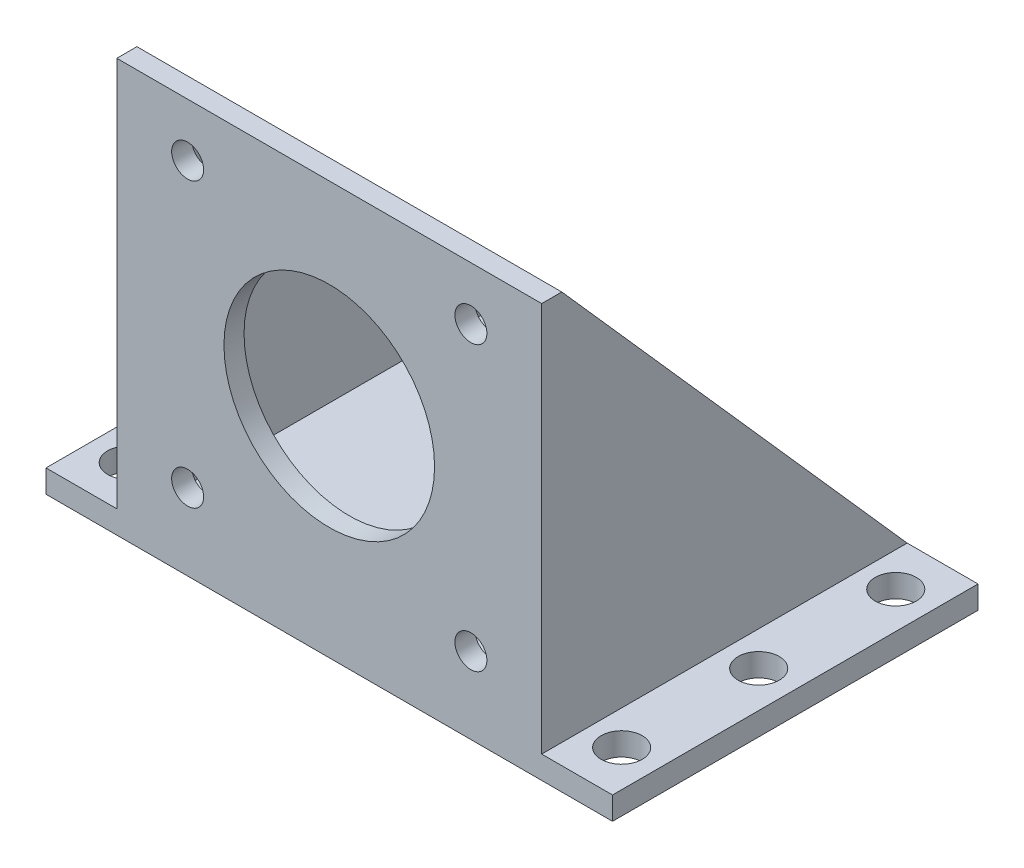
ISO-10303-21;
HEADER;
FILE_DESCRIPTION(('STEP AP214'),'2;1');
FILE_NAME('part.step','',(''),(''),'','','');
FILE_SCHEMA(('AUTOMOTIVE_DESIGN { 1 0 10303 214 1 1 1 1 }'));
ENDSEC;
DATA;
#1=APPLICATION_CONTEXT('core data for automotive mechanical design processes');
#2=APPLICATION_PROTOCOL_DEFINITION('international standard','automotive_design',2000,#1);
#3=PRODUCT_CONTEXT('',#1,'mechanical');
#4=PRODUCT('Part','Part','',(#3));
#5=PRODUCT_RELATED_PRODUCT_CATEGORY('part','',(#4));
#6=PRODUCT_DEFINITION_FORMATION('','',#4);
#7=PRODUCT_DEFINITION_CONTEXT('part definition',#1,'design');
#8=PRODUCT_DEFINITION('design','',#6,#7);
#9=PRODUCT_DEFINITION_SHAPE('','',#8);
#10=(LENGTH_UNIT() NAMED_UNIT(*) SI_UNIT(.MILLI.,.METRE.));
#11=(NAMED_UNIT(*) PLANE_ANGLE_UNIT() SI_UNIT($,.RADIAN.));
#12=(NAMED_UNIT(*) SI_UNIT($,.STERADIAN.) SOLID_ANGLE_UNIT());
#13=UNCERTAINTY_MEASURE_WITH_UNIT(LENGTH_MEASURE(1.E-05),#10,'distance_accuracy_value','');
#14=(GEOMETRIC_REPRESENTATION_CONTEXT(3) GLOBAL_UNCERTAINTY_ASSIGNED_CONTEXT((#13)) GLOBAL_UNIT_ASSIGNED_CONTEXT((#10,
#11,#12)) REPRESENTATION_CONTEXT('',''));
#15=CARTESIAN_POINT('',(0.,0.,0.));
#16=DIRECTION('',(0.,0.,1.));
#17=DIRECTION('',(1.,0.,0.));
#18=AXIS2_PLACEMENT_3D('',#15,#16,#17);
#19=CARTESIAN_POINT('',(0.,2.5,0.));
#20=DIRECTION('',(0.,1.,0.));
#21=DIRECTION('',(0.,0.,1.));
#22=AXIS2_PLACEMENT_3D('',#19,#20,#21);
#23=PLANE('',#22);
#24=DIRECTION('',(-1.,0.,0.));
#25=VECTOR('',#24,1.);
#26=CARTESIAN_POINT('',(0.,2.5,17.8));
#27=LINE('',#26,#25);
#28=CARTESIAN_POINT('',(21.65,2.5,17.8));
#29=VERTEX_POINT('',#28);
#30=CARTESIAN_POINT('',(-21.65,2.5,17.8));
#31=VERTEX_POINT('',#30);
#32=EDGE_CURVE('E130',#29,#31,#27,.T.);
#33=ORIENTED_EDGE('',*,*,#32,.F.);
#34=DIRECTION('',(0.,0.,-1.));
#35=VECTOR('',#34,1.);
#36=CARTESIAN_POINT('',(21.65,2.5,17.8));
#37=LINE('',#36,#35);
#38=CARTESIAN_POINT('',(21.65,2.5,-20.));
#39=VERTEX_POINT('',#38);
#40=EDGE_CURVE('E119',#29,#39,#37,.T.);
#41=ORIENTED_EDGE('',*,*,#40,.T.);
#42=DIRECTION('',(-1.,0.,0.));
#43=VECTOR('',#42,1.);
#44=CARTESIAN_POINT('',(-31.,2.5,-20.));
#45=LINE('',#44,#43);
#46=CARTESIAN_POINT('',(-21.65,2.5,-20.));
#47=VERTEX_POINT('',#46);
#48=EDGE_CURVE('E57',#39,#47,#45,.T.);
#49=ORIENTED_EDGE('',*,*,#48,.T.);
#50=DIRECTION('',(0.,0.,1.));
#51=VECTOR('',#50,1.);
#52=CARTESIAN_POINT('',(-21.65,2.5,17.8));
#53=LINE('',#52,#51);
#54=EDGE_CURVE('E136',#47,#31,#53,.T.);
#55=ORIENTED_EDGE('',*,*,#54,.T.);
#56=EDGE_LOOP('',(#33,#41,#49,#55));
#57=FACE_BOUND('',#56,.T.);
#58=ADVANCED_FACE('F34',(#57),#23,.T.);
#59=CARTESIAN_POINT('',(0.,0.,17.8));
#60=DIRECTION('',(0.,0.,1.));
#61=DIRECTION('',(1.,0.,0.));
#62=AXIS2_PLACEMENT_3D('',#59,#60,#61);
#63=PLANE('',#62);
#64=CARTESIAN_POINT('',(15.4999999999999,39.3750000000001,17.8));
#65=DIRECTION('',(0.,0.,1.));
#66=DIRECTION('',(1.,0.,0.));
#67=AXIS2_PLACEMENT_3D('',#64,#65,#66);
#68=CIRCLE('',#67,1.75000000000006);
#69=CARTESIAN_POINT('',(17.25,39.3750000000001,17.8));
#70=VERTEX_POINT('',#69);
#71=EDGE_CURVE('E173',#70,#70,#68,.T.);
#72=ORIENTED_EDGE('',*,*,#71,.T.);
#73=EDGE_LOOP('',(#72));
#74=FACE_BOUND('',#73,.T.);
#75=CARTESIAN_POINT('',(-15.5000000000001,39.375,17.8));
#76=DIRECTION('',(0.,0.,1.));
#77=DIRECTION('',(1.,0.,0.));
#78=AXIS2_PLACEMENT_3D('',#75,#76,#77);
#79=CIRCLE('',#78,1.75000000000008);
#80=CARTESIAN_POINT('',(-13.75,39.375,17.8));
#81=VERTEX_POINT('',#80);
#82=EDGE_CURVE('E302',#81,#81,#79,.T.);
#83=ORIENTED_EDGE('',*,*,#82,.T.);
#84=EDGE_LOOP('',(#83));
#85=FACE_BOUND('',#84,.T.);
#86=CARTESIAN_POINT('',(-15.5,8.37499999999999,17.8));
#87=DIRECTION('',(0.,0.,1.));
#88=DIRECTION('',(1.,0.,0.));
#89=AXIS2_PLACEMENT_3D('',#86,#87,#88);
#90=CIRCLE('',#89,1.75);
#91=CARTESIAN_POINT('',(-13.75,8.37499999999999,17.8));
#92=VERTEX_POINT('',#91);
#93=EDGE_CURVE('E305',#92,#92,#90,.T.);
#94=ORIENTED_EDGE('',*,*,#93,.T.);
#95=EDGE_LOOP('',(#94));
#96=FACE_BOUND('',#95,.T.);
#97=CARTESIAN_POINT('',(15.5,8.37499999999994,17.8));
#98=DIRECTION('',(0.,0.,1.));
#99=DIRECTION('',(1.,0.,0.));
#100=AXIS2_PLACEMENT_3D('',#97,#98,#99);
#101=CIRCLE('',#100,1.75);
#102=CARTESIAN_POINT('',(17.25,8.37499999999994,17.8));
#103=VERTEX_POINT('',#102);
#104=EDGE_CURVE('E143',#103,#103,#101,.T.);
#105=ORIENTED_EDGE('',*,*,#104,.T.);
#106=EDGE_LOOP('',(#105));
#107=FACE_BOUND('',#106,.T.);
#108=CARTESIAN_POINT('',(0.,23.875,17.8));
#109=DIRECTION('',(0.,0.,1.));
#110=DIRECTION('',(1.,0.,0.));
#111=AXIS2_PLACEMENT_3D('',#108,#109,#110);
#112=CIRCLE('',#111,11.525);
#113=CARTESIAN_POINT('',(11.525,23.875,17.8));
#114=VERTEX_POINT('',#113);
#115=EDGE_CURVE('E138',#114,#114,#112,.T.);
#116=ORIENTED_EDGE('',*,*,#115,.T.);
#117=EDGE_LOOP('',(#116));
#118=FACE_BOUND('',#117,.T.);
#119=DIRECTION('',(0.,-1.,0.));
#120=VECTOR('',#119,1.);
#121=CARTESIAN_POINT('',(21.65,45.2,17.8));
#122=LINE('',#121,#120);
#123=CARTESIAN_POINT('',(21.65,45.2,17.8));
#124=VERTEX_POINT('',#123);
#125=EDGE_CURVE('E122',#124,#29,#122,.T.);
#126=ORIENTED_EDGE('',*,*,#125,.T.);
#127=ORIENTED_EDGE('',*,*,#32,.T.);
#128=DIRECTION('',(0.,1.,0.));
#129=VECTOR('',#128,1.);
#130=CARTESIAN_POINT('',(-21.65,45.2,17.8));
#131=LINE('',#130,#129);
#132=CARTESIAN_POINT('',(-21.65,45.2,17.8));
#133=VERTEX_POINT('',#132);
#134=EDGE_CURVE('E291',#31,#133,#131,.T.);
#135=ORIENTED_EDGE('',*,*,#134,.T.);
#136=DIRECTION('',(1.,0.,0.));
#137=VECTOR('',#136,1.);
#138=CARTESIAN_POINT('',(0.,45.2,17.8));
#139=LINE('',#138,#137);
#140=EDGE_CURVE('E132',#133,#124,#139,.T.);
#141=ORIENTED_EDGE('',*,*,#140,.T.);
#142=EDGE_LOOP('',(#126,#127,#135,#141));
#143=FACE_BOUND('',#142,.T.);
#144=ADVANCED_FACE('F129',(#74,#85,#96,#107,#118,#143),#63,.F.);
#145=CARTESIAN_POINT('',(31.,2.5,-20.));
#146=VERTEX_POINT('',#145);
#147=CARTESIAN_POINT('',(23.25,2.5,-20.));
#148=VERTEX_POINT('',#147);
#149=EDGE_CURVE('E224',#146,#148,#45,.T.);
#150=ORIENTED_EDGE('',*,*,#149,.T.);
#151=DIRECTION('',(0.,0.,1.));
#152=VECTOR('',#151,1.);
#153=CARTESIAN_POINT('',(23.25,2.5,17.8));
#154=LINE('',#153,#152);
#155=CARTESIAN_POINT('',(23.25,2.5,20.));
#156=VERTEX_POINT('',#155);
#157=EDGE_CURVE('E148',#148,#156,#154,.T.);
#158=ORIENTED_EDGE('',*,*,#157,.T.);
#159=DIRECTION('',(1.,0.,0.));
#160=VECTOR('',#159,1.);
#161=CARTESIAN_POINT('',(-31.,2.5,20.));
#162=LINE('',#161,#160);
#163=CARTESIAN_POINT('',(31.,2.5,20.));
#164=VERTEX_POINT('',#163);
#165=EDGE_CURVE('E229',#156,#164,#162,.T.);
#166=ORIENTED_EDGE('',*,*,#165,.T.);
#167=DIRECTION('',(0.,0.,-1.));
#168=VECTOR('',#167,1.);
#169=CARTESIAN_POINT('',(31.,2.5,-20.));
#170=LINE('',#169,#168);
#171=EDGE_CURVE('E219',#164,#146,#170,.T.);
#172=ORIENTED_EDGE('',*,*,#171,.T.);
#173=EDGE_LOOP('',(#150,#158,#166,#172));
#174=FACE_BOUND('',#173,.T.);
#175=CARTESIAN_POINT('',(27.0000000000002,2.5,15.));
#176=DIRECTION('',(0.,1.,0.));
#177=DIRECTION('',(0.,0.,1.));
#178=AXIS2_PLACEMENT_3D('',#175,#176,#177);
#179=CIRCLE('',#178,2.25);
#180=CARTESIAN_POINT('',(27.0000000000002,2.5,17.25));
#181=VERTEX_POINT('',#180);
#182=EDGE_CURVE('E183',#181,#181,#179,.T.);
#183=ORIENTED_EDGE('',*,*,#182,.F.);
#184=EDGE_LOOP('',(#183));
#185=FACE_BOUND('',#184,.T.);
#186=CARTESIAN_POINT('',(27.,2.5,-15.));
#187=DIRECTION('',(0.,1.,0.));
#188=DIRECTION('',(0.,0.,1.));
#189=AXIS2_PLACEMENT_3D('',#186,#187,#188);
#190=CIRCLE('',#189,2.25);
#191=CARTESIAN_POINT('',(27.,2.5,-12.75));
#192=VERTEX_POINT('',#191);
#193=EDGE_CURVE('E195',#192,#192,#190,.T.);
#194=ORIENTED_EDGE('',*,*,#193,.F.);
#195=EDGE_LOOP('',(#194));
#196=FACE_BOUND('',#195,.T.);
#197=CARTESIAN_POINT('',(27.,2.5,0.));
#198=DIRECTION('',(0.,1.,0.));
#199=DIRECTION('',(0.,0.,1.));
#200=AXIS2_PLACEMENT_3D('',#197,#198,#199);
#201=CIRCLE('',#200,2.25);
#202=CARTESIAN_POINT('',(27.,2.5,2.24999999999999));
#203=VERTEX_POINT('',#202);
#204=EDGE_CURVE('E207',#203,#203,#201,.T.);
#205=ORIENTED_EDGE('',*,*,#204,.F.);
#206=EDGE_LOOP('',(#205));
#207=FACE_BOUND('',#206,.T.);
#208=ADVANCED_FACE('F267',(#174,#185,#196,#207),#23,.T.);
#209=DIRECTION('',(0.,0.,1.));
#210=VECTOR('',#209,1.);
#211=CARTESIAN_POINT('',(-23.25,2.5,17.8));
#212=LINE('',#211,#210);
#213=CARTESIAN_POINT('',(-23.25,2.5,-20.));
#214=VERTEX_POINT('',#213);
#215=CARTESIAN_POINT('',(-23.25,2.5,20.));
#216=VERTEX_POINT('',#215);
#217=EDGE_CURVE('E49',#214,#216,#212,.T.);
#218=ORIENTED_EDGE('',*,*,#217,.F.);
#219=CARTESIAN_POINT('',(-31.,2.5,-20.));
#220=VERTEX_POINT('',#219);
#221=EDGE_CURVE('E222',#214,#220,#45,.T.);
#222=ORIENTED_EDGE('',*,*,#221,.T.);
#223=DIRECTION('',(0.,0.,1.));
#224=VECTOR('',#223,1.);
#225=CARTESIAN_POINT('',(-31.,2.5,-20.));
#226=LINE('',#225,#224);
#227=CARTESIAN_POINT('',(-31.,2.5,20.));
#228=VERTEX_POINT('',#227);
#229=EDGE_CURVE('E227',#220,#228,#226,.T.);
#230=ORIENTED_EDGE('',*,*,#229,.T.);
#231=EDGE_CURVE('E230',#228,#216,#162,.T.);
#232=ORIENTED_EDGE('',*,*,#231,.T.);
#233=EDGE_LOOP('',(#218,#222,#230,#232));
#234=FACE_BOUND('',#233,.T.);
#235=CARTESIAN_POINT('',(-26.9999999999998,2.5,15.));
#236=DIRECTION('',(0.,1.,0.));
#237=DIRECTION('',(0.,0.,1.));
#238=AXIS2_PLACEMENT_3D('',#235,#236,#237);
#239=CIRCLE('',#238,2.25);
#240=CARTESIAN_POINT('',(-26.9999999999998,2.5,17.25));
#241=VERTEX_POINT('',#240);
#242=EDGE_CURVE('E189',#241,#241,#239,.T.);
#243=ORIENTED_EDGE('',*,*,#242,.F.);
#244=EDGE_LOOP('',(#243));
#245=FACE_BOUND('',#244,.T.);
#246=CARTESIAN_POINT('',(-27.,2.5,-15.));
#247=DIRECTION('',(0.,1.,0.));
#248=DIRECTION('',(0.,0.,1.));
#249=AXIS2_PLACEMENT_3D('',#246,#247,#248);
#250=CIRCLE('',#249,2.25);
#251=CARTESIAN_POINT('',(-27.,2.5,-12.75));
#252=VERTEX_POINT('',#251);
#253=EDGE_CURVE('E201',#252,#252,#250,.T.);
#254=ORIENTED_EDGE('',*,*,#253,.F.);
#255=EDGE_LOOP('',(#254));
#256=FACE_BOUND('',#255,.T.);
#257=CARTESIAN_POINT('',(-27.,2.5,0.));
#258=DIRECTION('',(0.,1.,0.));
#259=DIRECTION('',(0.,0.,1.));
#260=AXIS2_PLACEMENT_3D('',#257,#258,#259);
#261=CIRCLE('',#260,2.25);
#262=CARTESIAN_POINT('',(-27.,2.5,2.25));
#263=VERTEX_POINT('',#262);
#264=EDGE_CURVE('E213',#263,#263,#261,.T.);
#265=ORIENTED_EDGE('',*,*,#264,.F.);
#266=EDGE_LOOP('',(#265));
#267=FACE_BOUND('',#266,.T.);
#268=ADVANCED_FACE('F337',(#234,#245,#256,#267),#23,.T.);
#269=CARTESIAN_POINT('',(0.,0.,0.));
#270=DIRECTION('',(0.,1.,0.));
#271=DIRECTION('',(0.,0.,1.));
#272=AXIS2_PLACEMENT_3D('',#269,#270,#271);
#273=PLANE('',#272);
#274=DIRECTION('',(0.,0.,-1.));
#275=VECTOR('',#274,1.);
#276=CARTESIAN_POINT('',(31.,0.,-20.));
#277=LINE('',#276,#275);
#278=CARTESIAN_POINT('',(31.,0.,20.));
#279=VERTEX_POINT('',#278);
#280=CARTESIAN_POINT('',(31.,0.,-20.));
#281=VERTEX_POINT('',#280);
#282=EDGE_CURVE('E216',#279,#281,#277,.T.);
#283=ORIENTED_EDGE('',*,*,#282,.F.);
#284=DIRECTION('',(1.,0.,0.));
#285=VECTOR('',#284,1.);
#286=CARTESIAN_POINT('',(-31.,0.,20.));
#287=LINE('',#286,#285);
#288=CARTESIAN_POINT('',(-31.,0.,20.));
#289=VERTEX_POINT('',#288);
#290=EDGE_CURVE('E223',#289,#279,#287,.T.);
#291=ORIENTED_EDGE('',*,*,#290,.F.);
#292=DIRECTION('',(0.,0.,1.));
#293=VECTOR('',#292,1.);
#294=CARTESIAN_POINT('',(-31.,0.,-20.));
#295=LINE('',#294,#293);
#296=CARTESIAN_POINT('',(-31.,0.,-20.));
#297=VERTEX_POINT('',#296);
#298=EDGE_CURVE('E237',#297,#289,#295,.T.);
#299=ORIENTED_EDGE('',*,*,#298,.F.);
#300=DIRECTION('',(-1.,0.,0.));
#301=VECTOR('',#300,1.);
#302=CARTESIAN_POINT('',(-31.,0.,-20.));
#303=LINE('',#302,#301);
#304=EDGE_CURVE('E235',#281,#297,#303,.T.);
#305=ORIENTED_EDGE('',*,*,#304,.F.);
#306=EDGE_LOOP('',(#283,#291,#299,#305));
#307=FACE_BOUND('',#306,.T.);
#308=CARTESIAN_POINT('',(-27.,0.,0.));
#309=DIRECTION('',(0.,1.,0.));
#310=DIRECTION('',(0.,0.,1.));
#311=AXIS2_PLACEMENT_3D('',#308,#309,#310);
#312=CIRCLE('',#311,2.25);
#313=CARTESIAN_POINT('',(-27.,0.,2.25));
#314=VERTEX_POINT('',#313);
#315=EDGE_CURVE('E210',#314,#314,#312,.T.);
#316=ORIENTED_EDGE('',*,*,#315,.T.);
#317=EDGE_LOOP('',(#316));
#318=FACE_BOUND('',#317,.T.);
#319=CARTESIAN_POINT('',(27.,0.,0.));
#320=DIRECTION('',(0.,1.,0.));
#321=DIRECTION('',(0.,0.,1.));
#322=AXIS2_PLACEMENT_3D('',#319,#320,#321);
#323=CIRCLE('',#322,2.25);
#324=CARTESIAN_POINT('',(27.,0.,2.24999999999999));
#325=VERTEX_POINT('',#324);
#326=EDGE_CURVE('E204',#325,#325,#323,.T.);
#327=ORIENTED_EDGE('',*,*,#326,.T.);
#328=EDGE_LOOP('',(#327));
#329=FACE_BOUND('',#328,.T.);
#330=CARTESIAN_POINT('',(-27.,0.,-15.));
#331=DIRECTION('',(0.,1.,0.));
#332=DIRECTION('',(0.,0.,1.));
#333=AXIS2_PLACEMENT_3D('',#330,#331,#332);
#334=CIRCLE('',#333,2.25);
#335=CARTESIAN_POINT('',(-27.,0.,-12.75));
#336=VERTEX_POINT('',#335);
#337=EDGE_CURVE('E198',#336,#336,#334,.T.);
#338=ORIENTED_EDGE('',*,*,#337,.T.);
#339=EDGE_LOOP('',(#338));
#340=FACE_BOUND('',#339,.T.);
#341=CARTESIAN_POINT('',(27.,0.,-15.));
#342=DIRECTION('',(0.,1.,0.));
#343=DIRECTION('',(0.,0.,1.));
#344=AXIS2_PLACEMENT_3D('',#341,#342,#343);
#345=CIRCLE('',#344,2.25);
#346=CARTESIAN_POINT('',(27.,0.,-12.75));
#347=VERTEX_POINT('',#346);
#348=EDGE_CURVE('E192',#347,#347,#345,.T.);
#349=ORIENTED_EDGE('',*,*,#348,.T.);
#350=EDGE_LOOP('',(#349));
#351=FACE_BOUND('',#350,.T.);
#352=CARTESIAN_POINT('',(-26.9999999999998,0.,15.));
#353=DIRECTION('',(0.,1.,0.));
#354=DIRECTION('',(0.,0.,1.));
#355=AXIS2_PLACEMENT_3D('',#352,#353,#354);
#356=CIRCLE('',#355,2.25);
#357=CARTESIAN_POINT('',(-26.9999999999998,0.,17.25));
#358=VERTEX_POINT('',#357);
#359=EDGE_CURVE('E186',#358,#358,#356,.T.);
#360=ORIENTED_EDGE('',*,*,#359,.T.);
#361=EDGE_LOOP('',(#360));
#362=FACE_BOUND('',#361,.T.);
#363=CARTESIAN_POINT('',(27.0000000000002,0.,15.));
#364=DIRECTION('',(0.,1.,0.));
#365=DIRECTION('',(0.,0.,1.));
#366=AXIS2_PLACEMENT_3D('',#363,#364,#365);
#367=CIRCLE('',#366,2.25);
#368=CARTESIAN_POINT('',(27.0000000000002,0.,17.25));
#369=VERTEX_POINT('',#368);
#370=EDGE_CURVE('E175',#369,#369,#367,.T.);
#371=ORIENTED_EDGE('',*,*,#370,.T.);
#372=EDGE_LOOP('',(#371));
#373=FACE_BOUND('',#372,.T.);
#374=ADVANCED_FACE('F255',(#307,#318,#329,#340,#351,#362,#373),#273,.F.);
#375=CARTESIAN_POINT('',(31.,2.5,-20.));
#376=DIRECTION('',(-1.,0.,0.));
#377=DIRECTION('',(0.,0.,1.));
#378=AXIS2_PLACEMENT_3D('',#375,#376,#377);
#379=PLANE('',#378);
#380=ORIENTED_EDGE('',*,*,#282,.T.);
#381=DIRECTION('',(0.,-1.,0.));
#382=VECTOR('',#381,1.);
#383=CARTESIAN_POINT('',(31.,2.5,-20.));
#384=LINE('',#383,#382);
#385=EDGE_CURVE('E11',#146,#281,#384,.T.);
#386=ORIENTED_EDGE('',*,*,#385,.F.);
#387=ORIENTED_EDGE('',*,*,#171,.F.);
#388=DIRECTION('',(0.,-1.,0.));
#389=VECTOR('',#388,1.);
#390=CARTESIAN_POINT('',(31.,2.5,20.));
#391=LINE('',#390,#389);
#392=EDGE_CURVE('E232',#164,#279,#391,.T.);
#393=ORIENTED_EDGE('',*,*,#392,.T.);
#394=EDGE_LOOP('',(#380,#386,#387,#393));
#395=FACE_BOUND('',#394,.T.);
#396=ADVANCED_FACE('F36',(#395),#379,.F.);
#397=CARTESIAN_POINT('',(-31.,2.5,-20.));
#398=DIRECTION('',(0.,0.,1.));
#399=DIRECTION('',(1.,0.,0.));
#400=AXIS2_PLACEMENT_3D('',#397,#398,#399);
#401=PLANE('',#400);
#402=ORIENTED_EDGE('',*,*,#304,.T.);
#403=DIRECTION('',(0.,-1.,0.));
#404=VECTOR('',#403,1.);
#405=CARTESIAN_POINT('',(-31.,2.5,-20.));
#406=LINE('',#405,#404);
#407=EDGE_CURVE('E42',#220,#297,#406,.T.);
#408=ORIENTED_EDGE('',*,*,#407,.F.);
#409=ORIENTED_EDGE('',*,*,#221,.F.);
#410=DIRECTION('',(-1.,0.,0.));
#411=VECTOR('',#410,1.);
#412=CARTESIAN_POINT('',(-21.65,2.5,-20.));
#413=LINE('',#412,#411);
#414=EDGE_CURVE('E153',#47,#214,#413,.T.);
#415=ORIENTED_EDGE('',*,*,#414,.F.);
#416=ORIENTED_EDGE('',*,*,#48,.F.);
#417=DIRECTION('',(1.,0.,0.));
#418=VECTOR('',#417,1.);
#419=CARTESIAN_POINT('',(21.65,2.5,-20.));
#420=LINE('',#419,#418);
#421=EDGE_CURVE('E293',#39,#148,#420,.T.);
#422=ORIENTED_EDGE('',*,*,#421,.T.);
#423=ORIENTED_EDGE('',*,*,#149,.F.);
#424=ORIENTED_EDGE('',*,*,#385,.T.);
#425=EDGE_LOOP('',(#402,#408,#409,#415,#416,#422,#423,#424));
#426=FACE_BOUND('',#425,.T.);
#427=ADVANCED_FACE('F522',(#426),#401,.F.);
#428=CARTESIAN_POINT('',(-31.,2.5,-20.));
#429=DIRECTION('',(1.,0.,0.));
#430=DIRECTION('',(0.,0.,-1.));
#431=AXIS2_PLACEMENT_3D('',#428,#429,#430);
#432=PLANE('',#431);
#433=ORIENTED_EDGE('',*,*,#298,.T.);
#434=DIRECTION('',(0.,-1.,0.));
#435=VECTOR('',#434,1.);
#436=CARTESIAN_POINT('',(-31.,2.5,20.));
#437=LINE('',#436,#435);
#438=EDGE_CURVE('E242',#228,#289,#437,.T.);
#439=ORIENTED_EDGE('',*,*,#438,.F.);
#440=ORIENTED_EDGE('',*,*,#229,.F.);
#441=ORIENTED_EDGE('',*,*,#407,.T.);
#442=EDGE_LOOP('',(#433,#439,#440,#441));
#443=FACE_BOUND('',#442,.T.);
#444=ADVANCED_FACE('F249',(#443),#432,.F.);
#445=CARTESIAN_POINT('',(-31.,2.5,20.));
#446=DIRECTION('',(0.,0.,-1.));
#447=DIRECTION('',(-1.,0.,0.));
#448=AXIS2_PLACEMENT_3D('',#445,#446,#447);
#449=PLANE('',#448);
#450=ORIENTED_EDGE('',*,*,#290,.T.);
#451=ORIENTED_EDGE('',*,*,#392,.F.);
#452=ORIENTED_EDGE('',*,*,#165,.F.);
#453=DIRECTION('',(0.,1.,0.));
#454=VECTOR('',#453,1.);
#455=CARTESIAN_POINT('',(23.25,0.,20.));
#456=LINE('',#455,#454);
#457=CARTESIAN_POINT('',(23.25,45.2,20.));
#458=VERTEX_POINT('',#457);
#459=EDGE_CURVE('E165',#156,#458,#456,.T.);
#460=ORIENTED_EDGE('',*,*,#459,.T.);
#461=DIRECTION('',(1.,0.,0.));
#462=VECTOR('',#461,1.);
#463=CARTESIAN_POINT('',(0.,45.2,20.));
#464=LINE('',#463,#462);
#465=CARTESIAN_POINT('',(-23.25,45.2,20.));
#466=VERTEX_POINT('',#465);
#467=EDGE_CURVE('E168',#466,#458,#464,.T.);
#468=ORIENTED_EDGE('',*,*,#467,.F.);
#469=DIRECTION('',(0.,1.,0.));
#470=VECTOR('',#469,1.);
#471=CARTESIAN_POINT('',(-23.25,0.,20.));
#472=LINE('',#471,#470);
#473=EDGE_CURVE('E171',#216,#466,#472,.T.);
#474=ORIENTED_EDGE('',*,*,#473,.F.);
#475=ORIENTED_EDGE('',*,*,#231,.F.);
#476=ORIENTED_EDGE('',*,*,#438,.T.);
#477=EDGE_LOOP('',(#450,#451,#452,#460,#468,#474,#475,#476));
#478=FACE_BOUND('',#477,.T.);
#479=CARTESIAN_POINT('',(15.4999999999999,39.3750000000001,20.));
#480=DIRECTION('',(0.,0.,1.));
#481=DIRECTION('',(1.,0.,0.));
#482=AXIS2_PLACEMENT_3D('',#479,#480,#481);
#483=CIRCLE('',#482,1.75000000000006);
#484=CARTESIAN_POINT('',(17.25,39.3750000000001,20.));
#485=VERTEX_POINT('',#484);
#486=EDGE_CURVE('E149',#485,#485,#483,.T.);
#487=ORIENTED_EDGE('',*,*,#486,.F.);
#488=EDGE_LOOP('',(#487));
#489=FACE_BOUND('',#488,.T.);
#490=CARTESIAN_POINT('',(-15.5000000000001,39.375,20.));
#491=DIRECTION('',(0.,0.,1.));
#492=DIRECTION('',(1.,0.,0.));
#493=AXIS2_PLACEMENT_3D('',#490,#491,#492);
#494=CIRCLE('',#493,1.75000000000008);
#495=CARTESIAN_POINT('',(-13.75,39.375,20.));
#496=VERTEX_POINT('',#495);
#497=EDGE_CURVE('E152',#496,#496,#494,.T.);
#498=ORIENTED_EDGE('',*,*,#497,.F.);
#499=EDGE_LOOP('',(#498));
#500=FACE_BOUND('',#499,.T.);
#501=CARTESIAN_POINT('',(-15.5,8.37499999999999,20.));
#502=DIRECTION('',(0.,0.,1.));
#503=DIRECTION('',(1.,0.,0.));
#504=AXIS2_PLACEMENT_3D('',#501,#502,#503);
#505=CIRCLE('',#504,1.75);
#506=CARTESIAN_POINT('',(-13.75,8.37499999999999,20.));
#507=VERTEX_POINT('',#506);
#508=EDGE_CURVE('E156',#507,#507,#505,.T.);
#509=ORIENTED_EDGE('',*,*,#508,.F.);
#510=EDGE_LOOP('',(#509));
#511=FACE_BOUND('',#510,.T.);
#512=CARTESIAN_POINT('',(15.5,8.37499999999994,20.));
#513=DIRECTION('',(0.,0.,1.));
#514=DIRECTION('',(1.,0.,0.));
#515=AXIS2_PLACEMENT_3D('',#512,#513,#514);
#516=CIRCLE('',#515,1.75);
#517=CARTESIAN_POINT('',(17.25,8.37499999999994,20.));
#518=VERTEX_POINT('',#517);
#519=EDGE_CURVE('E159',#518,#518,#516,.T.);
#520=ORIENTED_EDGE('',*,*,#519,.F.);
#521=EDGE_LOOP('',(#520));
#522=FACE_BOUND('',#521,.T.);
#523=CARTESIAN_POINT('',(0.,23.875,20.));
#524=DIRECTION('',(0.,0.,1.));
#525=DIRECTION('',(1.,0.,0.));
#526=AXIS2_PLACEMENT_3D('',#523,#524,#525);
#527=CIRCLE('',#526,11.525);
#528=CARTESIAN_POINT('',(11.525,23.875,20.));
#529=VERTEX_POINT('',#528);
#530=EDGE_CURVE('E162',#529,#529,#527,.T.);
#531=ORIENTED_EDGE('',*,*,#530,.F.);
#532=EDGE_LOOP('',(#531));
#533=FACE_BOUND('',#532,.T.);
#534=ADVANCED_FACE('F259',(#478,#489,#500,#511,#522,#533),#449,.F.);
#535=CARTESIAN_POINT('',(-27.,2.5,0.));
#536=DIRECTION('',(0.,-1.,0.));
#537=DIRECTION('',(0.,0.,-1.));
#538=AXIS2_PLACEMENT_3D('',#535,#536,#537);
#539=CYLINDRICAL_SURFACE('',#538,2.25);
#540=ORIENTED_EDGE('',*,*,#264,.T.);
#541=EDGE_LOOP('',(#540));
#542=FACE_BOUND('',#541,.T.);
#543=ORIENTED_EDGE('',*,*,#315,.F.);
#544=EDGE_LOOP('',(#543));
#545=FACE_BOUND('',#544,.T.);
#546=ADVANCED_FACE('F322',(#542,#545),#539,.F.);
#547=CARTESIAN_POINT('',(27.,2.5,0.));
#548=DIRECTION('',(0.,-1.,0.));
#549=DIRECTION('',(0.,0.,-1.));
#550=AXIS2_PLACEMENT_3D('',#547,#548,#549);
#551=CYLINDRICAL_SURFACE('',#550,2.25);
#552=ORIENTED_EDGE('',*,*,#204,.T.);
#553=EDGE_LOOP('',(#552));
#554=FACE_BOUND('',#553,.T.);
#555=ORIENTED_EDGE('',*,*,#326,.F.);
#556=EDGE_LOOP('',(#555));
#557=FACE_BOUND('',#556,.T.);
#558=ADVANCED_FACE('F359',(#554,#557),#551,.F.);
#559=CARTESIAN_POINT('',(-27.,2.5,-15.));
#560=DIRECTION('',(0.,-1.,0.));
#561=DIRECTION('',(0.,0.,-1.));
#562=AXIS2_PLACEMENT_3D('',#559,#560,#561);
#563=CYLINDRICAL_SURFACE('',#562,2.25);
#564=ORIENTED_EDGE('',*,*,#253,.T.);
#565=EDGE_LOOP('',(#564));
#566=FACE_BOUND('',#565,.T.);
#567=ORIENTED_EDGE('',*,*,#337,.F.);
#568=EDGE_LOOP('',(#567));
#569=FACE_BOUND('',#568,.T.);
#570=ADVANCED_FACE('F391',(#566,#569),#563,.F.);
#571=CARTESIAN_POINT('',(27.,2.5,-15.));
#572=DIRECTION('',(0.,-1.,0.));
#573=DIRECTION('',(0.,0.,-1.));
#574=AXIS2_PLACEMENT_3D('',#571,#572,#573);
#575=CYLINDRICAL_SURFACE('',#574,2.25);
#576=ORIENTED_EDGE('',*,*,#193,.T.);
#577=EDGE_LOOP('',(#576));
#578=FACE_BOUND('',#577,.T.);
#579=ORIENTED_EDGE('',*,*,#348,.F.);
#580=EDGE_LOOP('',(#579));
#581=FACE_BOUND('',#580,.T.);
#582=ADVANCED_FACE('F382',(#578,#581),#575,.F.);
#583=CARTESIAN_POINT('',(-26.9999999999998,2.5,15.));
#584=DIRECTION('',(0.,-1.,0.));
#585=DIRECTION('',(0.,0.,-1.));
#586=AXIS2_PLACEMENT_3D('',#583,#584,#585);
#587=CYLINDRICAL_SURFACE('',#586,2.25);
#588=ORIENTED_EDGE('',*,*,#242,.T.);
#589=EDGE_LOOP('',(#588));
#590=FACE_BOUND('',#589,.T.);
#591=ORIENTED_EDGE('',*,*,#359,.F.);
#592=EDGE_LOOP('',(#591));
#593=FACE_BOUND('',#592,.T.);
#594=ADVANCED_FACE('F374',(#590,#593),#587,.F.);
#595=CARTESIAN_POINT('',(27.0000000000002,2.5,15.));
#596=DIRECTION('',(0.,-1.,0.));
#597=DIRECTION('',(0.,0.,-1.));
#598=AXIS2_PLACEMENT_3D('',#595,#596,#597);
#599=CYLINDRICAL_SURFACE('',#598,2.25);
#600=ORIENTED_EDGE('',*,*,#182,.T.);
#601=EDGE_LOOP('',(#600));
#602=FACE_BOUND('',#601,.T.);
#603=ORIENTED_EDGE('',*,*,#370,.F.);
#604=EDGE_LOOP('',(#603));
#605=FACE_BOUND('',#604,.T.);
#606=ADVANCED_FACE('F372',(#602,#605),#599,.F.);
#607=CARTESIAN_POINT('',(-23.25,0.,17.8));
#608=DIRECTION('',(1.,0.,0.));
#609=DIRECTION('',(0.,0.,-1.));
#610=AXIS2_PLACEMENT_3D('',#607,#608,#609);
#611=PLANE('',#610);
#612=ORIENTED_EDGE('',*,*,#473,.T.);
#613=DIRECTION('',(0.,0.,1.));
#614=VECTOR('',#613,1.);
#615=CARTESIAN_POINT('',(-23.25,45.2,17.8));
#616=LINE('',#615,#614);
#617=CARTESIAN_POINT('',(-23.25,45.2,17.8));
#618=VERTEX_POINT('',#617);
#619=EDGE_CURVE('E176',#618,#466,#616,.T.);
#620=ORIENTED_EDGE('',*,*,#619,.F.);
#621=DIRECTION('',(0.,-0.748762225055479,-0.662838691032719));
#622=VECTOR('',#621,1.);
#623=CARTESIAN_POINT('',(-23.25,2.5,-20.));
#624=LINE('',#623,#622);
#625=EDGE_CURVE('E283',#618,#214,#624,.T.);
#626=ORIENTED_EDGE('',*,*,#625,.T.);
#627=ORIENTED_EDGE('',*,*,#217,.T.);
#628=EDGE_LOOP('',(#612,#620,#626,#627));
#629=FACE_BOUND('',#628,.T.);
#630=ADVANCED_FACE('F282',(#629),#611,.F.);
#631=CARTESIAN_POINT('',(0.,45.2,17.8));
#632=DIRECTION('',(0.,-1.,0.));
#633=DIRECTION('',(0.,0.,-1.));
#634=AXIS2_PLACEMENT_3D('',#631,#632,#633);
#635=PLANE('',#634);
#636=ORIENTED_EDGE('',*,*,#467,.T.);
#637=DIRECTION('',(0.,0.,1.));
#638=VECTOR('',#637,1.);
#639=CARTESIAN_POINT('',(23.25,45.2,17.8));
#640=LINE('',#639,#638);
#641=CARTESIAN_POINT('',(23.25,45.2,17.8));
#642=VERTEX_POINT('',#641);
#643=EDGE_CURVE('E179',#642,#458,#640,.T.);
#644=ORIENTED_EDGE('',*,*,#643,.F.);
#645=DIRECTION('',(1.,0.,0.));
#646=VECTOR('',#645,1.);
#647=CARTESIAN_POINT('',(21.65,45.2,17.8));
#648=LINE('',#647,#646);
#649=EDGE_CURVE('E289',#124,#642,#648,.T.);
#650=ORIENTED_EDGE('',*,*,#649,.F.);
#651=ORIENTED_EDGE('',*,*,#140,.F.);
#652=EDGE_CURVE('E140',#618,#133,#139,.T.);
#653=ORIENTED_EDGE('',*,*,#652,.F.);
#654=ORIENTED_EDGE('',*,*,#619,.T.);
#655=EDGE_LOOP('',(#636,#644,#650,#651,#653,#654));
#656=FACE_BOUND('',#655,.T.);
#657=ADVANCED_FACE('F277',(#656),#635,.F.);
#658=CARTESIAN_POINT('',(0.,23.875,17.8));
#659=DIRECTION('',(0.,0.,1.));
#660=DIRECTION('',(1.,0.,0.));
#661=AXIS2_PLACEMENT_3D('',#658,#659,#660);
#662=CYLINDRICAL_SURFACE('',#661,11.525);
#663=ORIENTED_EDGE('',*,*,#115,.F.);
#664=EDGE_LOOP('',(#663));
#665=FACE_BOUND('',#664,.T.);
#666=ORIENTED_EDGE('',*,*,#530,.T.);
#667=EDGE_LOOP('',(#666));
#668=FACE_BOUND('',#667,.T.);
#669=ADVANCED_FACE('F316',(#665,#668),#662,.F.);
#670=CARTESIAN_POINT('',(15.5,8.37499999999994,17.8));
#671=DIRECTION('',(0.,0.,1.));
#672=DIRECTION('',(1.,0.,0.));
#673=AXIS2_PLACEMENT_3D('',#670,#671,#672);
#674=CYLINDRICAL_SURFACE('',#673,1.75);
#675=ORIENTED_EDGE('',*,*,#104,.F.);
#676=EDGE_LOOP('',(#675));
#677=FACE_BOUND('',#676,.T.);
#678=ORIENTED_EDGE('',*,*,#519,.T.);
#679=EDGE_LOOP('',(#678));
#680=FACE_BOUND('',#679,.T.);
#681=ADVANCED_FACE('F312',(#677,#680),#674,.F.);
#682=CARTESIAN_POINT('',(-15.5,8.37499999999999,17.8));
#683=DIRECTION('',(0.,0.,1.));
#684=DIRECTION('',(1.,0.,0.));
#685=AXIS2_PLACEMENT_3D('',#682,#683,#684);
#686=CYLINDRICAL_SURFACE('',#685,1.75);
#687=ORIENTED_EDGE('',*,*,#93,.F.);
#688=EDGE_LOOP('',(#687));
#689=FACE_BOUND('',#688,.T.);
#690=ORIENTED_EDGE('',*,*,#508,.T.);
#691=EDGE_LOOP('',(#690));
#692=FACE_BOUND('',#691,.T.);
#693=ADVANCED_FACE('F315',(#689,#692),#686,.F.);
#694=CARTESIAN_POINT('',(-15.5000000000001,39.375,17.8));
#695=DIRECTION('',(0.,0.,1.));
#696=DIRECTION('',(1.,0.,0.));
#697=AXIS2_PLACEMENT_3D('',#694,#695,#696);
#698=CYLINDRICAL_SURFACE('',#697,1.75000000000008);
#699=ORIENTED_EDGE('',*,*,#82,.F.);
#700=EDGE_LOOP('',(#699));
#701=FACE_BOUND('',#700,.T.);
#702=ORIENTED_EDGE('',*,*,#497,.T.);
#703=EDGE_LOOP('',(#702));
#704=FACE_BOUND('',#703,.T.);
#705=ADVANCED_FACE('F450',(#701,#704),#698,.F.);
#706=CARTESIAN_POINT('',(15.4999999999999,39.3750000000001,17.8));
#707=DIRECTION('',(0.,0.,1.));
#708=DIRECTION('',(1.,0.,0.));
#709=AXIS2_PLACEMENT_3D('',#706,#707,#708);
#710=CYLINDRICAL_SURFACE('',#709,1.75000000000006);
#711=ORIENTED_EDGE('',*,*,#71,.F.);
#712=EDGE_LOOP('',(#711));
#713=FACE_BOUND('',#712,.T.);
#714=ORIENTED_EDGE('',*,*,#486,.T.);
#715=EDGE_LOOP('',(#714));
#716=FACE_BOUND('',#715,.T.);
#717=ADVANCED_FACE('F386',(#713,#716),#710,.F.);
#718=CARTESIAN_POINT('',(23.25,0.,17.8));
#719=DIRECTION('',(1.,0.,0.));
#720=DIRECTION('',(0.,0.,-1.));
#721=AXIS2_PLACEMENT_3D('',#718,#719,#720);
#722=PLANE('',#721);
#723=ORIENTED_EDGE('',*,*,#459,.F.);
#724=ORIENTED_EDGE('',*,*,#157,.F.);
#725=DIRECTION('',(0.,0.748762225055479,0.662838691032719));
#726=VECTOR('',#725,1.);
#727=CARTESIAN_POINT('',(23.25,2.5,-20.));
#728=LINE('',#727,#726);
#729=EDGE_CURVE('E133',#148,#642,#728,.T.);
#730=ORIENTED_EDGE('',*,*,#729,.T.);
#731=ORIENTED_EDGE('',*,*,#643,.T.);
#732=EDGE_LOOP('',(#723,#724,#730,#731));
#733=FACE_BOUND('',#732,.T.);
#734=ADVANCED_FACE('F271',(#733),#722,.T.);
#735=CARTESIAN_POINT('',(-21.65,2.5,-20.));
#736=DIRECTION('',(0.,0.662838691032719,-0.748762225055479));
#737=DIRECTION('',(0.,0.748762225055479,0.662838691032719));
#738=AXIS2_PLACEMENT_3D('',#735,#736,#737);
#739=PLANE('',#738);
#740=ORIENTED_EDGE('',*,*,#625,.F.);
#741=ORIENTED_EDGE('',*,*,#652,.T.);
#742=DIRECTION('',(0.,-0.748762225055479,-0.662838691032719));
#743=VECTOR('',#742,1.);
#744=CARTESIAN_POINT('',(-21.65,2.5,-20.));
#745=LINE('',#744,#743);
#746=EDGE_CURVE('E297',#133,#47,#745,.T.);
#747=ORIENTED_EDGE('',*,*,#746,.T.);
#748=ORIENTED_EDGE('',*,*,#414,.T.);
#749=EDGE_LOOP('',(#740,#741,#747,#748));
#750=FACE_BOUND('',#749,.T.);
#751=ADVANCED_FACE('F286',(#750),#739,.T.);
#752=CARTESIAN_POINT('',(-21.65,0.,0.));
#753=DIRECTION('',(-1.,0.,0.));
#754=DIRECTION('',(0.,0.,1.));
#755=AXIS2_PLACEMENT_3D('',#752,#753,#754);
#756=PLANE('',#755);
#757=ORIENTED_EDGE('',*,*,#54,.F.);
#758=ORIENTED_EDGE('',*,*,#746,.F.);
#759=ORIENTED_EDGE('',*,*,#134,.F.);
#760=EDGE_LOOP('',(#757,#758,#759));
#761=FACE_BOUND('',#760,.T.);
#762=ADVANCED_FACE('F490',(#761),#756,.F.);
#763=CARTESIAN_POINT('',(21.65,2.5,-20.));
#764=DIRECTION('',(0.,0.662838691032719,-0.748762225055479));
#765=DIRECTION('',(0.,0.748762225055479,0.662838691032719));
#766=AXIS2_PLACEMENT_3D('',#763,#764,#765);
#767=PLANE('',#766);
#768=ORIENTED_EDGE('',*,*,#729,.F.);
#769=ORIENTED_EDGE('',*,*,#421,.F.);
#770=DIRECTION('',(0.,0.748762225055479,0.662838691032719));
#771=VECTOR('',#770,1.);
#772=CARTESIAN_POINT('',(21.65,2.5,-20.));
#773=LINE('',#772,#771);
#774=EDGE_CURVE('E124',#39,#124,#773,.T.);
#775=ORIENTED_EDGE('',*,*,#774,.T.);
#776=ORIENTED_EDGE('',*,*,#649,.T.);
#777=EDGE_LOOP('',(#768,#769,#775,#776));
#778=FACE_BOUND('',#777,.T.);
#779=ADVANCED_FACE('F498',(#778),#767,.T.);
#780=CARTESIAN_POINT('',(21.65,0.,0.));
#781=DIRECTION('',(1.,0.,0.));
#782=DIRECTION('',(0.,0.,-1.));
#783=AXIS2_PLACEMENT_3D('',#780,#781,#782);
#784=PLANE('',#783);
#785=ORIENTED_EDGE('',*,*,#125,.F.);
#786=ORIENTED_EDGE('',*,*,#774,.F.);
#787=ORIENTED_EDGE('',*,*,#40,.F.);
#788=EDGE_LOOP('',(#785,#786,#787));
#789=FACE_BOUND('',#788,.T.);
#790=ADVANCED_FACE('F121',(#789),#784,.F.);
#791=CLOSED_SHELL('',(#58,#144,#208,#268,#374,#396,#427,#444,#534,#546,#558,#570,#582,#594,#606,
#630,#657,#669,#681,#693,#705,#717,#734,#751,#762,#779,#790));
#792=MANIFOLD_SOLID_BREP('B2',#791);
#793=ADVANCED_BREP_SHAPE_REPRESENTATION('',(#18,#792),#14);
#794=SHAPE_DEFINITION_REPRESENTATION(#9,#793);
ENDSEC;
END-ISO-10303-21;
